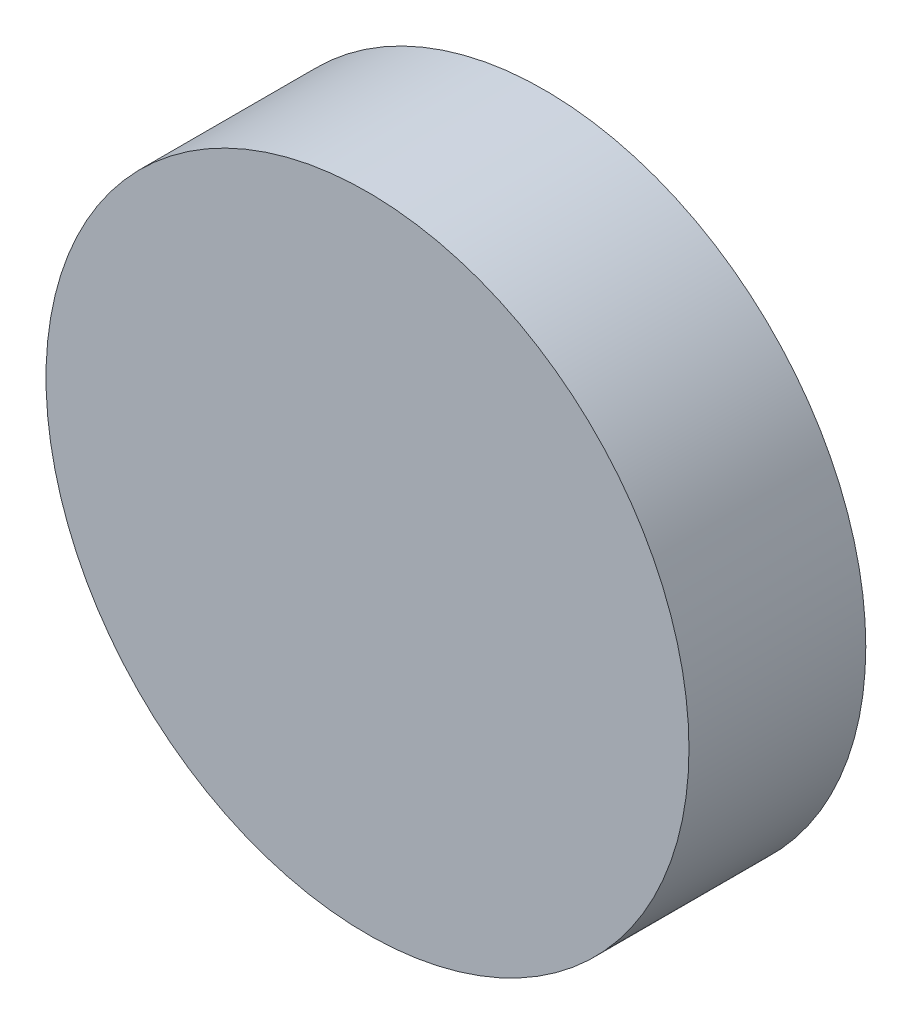
ISO-10303-21;
HEADER;
FILE_DESCRIPTION(('STEP AP214'),'2;1');
FILE_NAME('part.step','',(''),(''),'','','');
FILE_SCHEMA(('AUTOMOTIVE_DESIGN { 1 0 10303 214 1 1 1 1 }'));
ENDSEC;
DATA;
#1=APPLICATION_CONTEXT('core data for automotive mechanical design processes');
#2=APPLICATION_PROTOCOL_DEFINITION('international standard','automotive_design',2000,#1);
#3=PRODUCT_CONTEXT('',#1,'mechanical');
#4=PRODUCT('Part','Part','',(#3));
#5=PRODUCT_RELATED_PRODUCT_CATEGORY('part','',(#4));
#6=PRODUCT_DEFINITION_FORMATION('','',#4);
#7=PRODUCT_DEFINITION_CONTEXT('part definition',#1,'design');
#8=PRODUCT_DEFINITION('design','',#6,#7);
#9=PRODUCT_DEFINITION_SHAPE('','',#8);
#10=(LENGTH_UNIT() NAMED_UNIT(*) SI_UNIT(.MILLI.,.METRE.));
#11=(NAMED_UNIT(*) PLANE_ANGLE_UNIT() SI_UNIT($,.RADIAN.));
#12=(NAMED_UNIT(*) SI_UNIT($,.STERADIAN.) SOLID_ANGLE_UNIT());
#13=UNCERTAINTY_MEASURE_WITH_UNIT(LENGTH_MEASURE(1.E-05),#10,'distance_accuracy_value','');
#14=(GEOMETRIC_REPRESENTATION_CONTEXT(3) GLOBAL_UNCERTAINTY_ASSIGNED_CONTEXT((#13)) GLOBAL_UNIT_ASSIGNED_CONTEXT((#10,
#11,#12)) REPRESENTATION_CONTEXT('',''));
#15=CARTESIAN_POINT('',(0.,0.,0.));
#16=DIRECTION('',(0.,0.,1.));
#17=DIRECTION('',(1.,0.,0.));
#18=AXIS2_PLACEMENT_3D('',#15,#16,#17);
#19=CARTESIAN_POINT('',(0.,0.,11.));
#20=DIRECTION('',(0.,0.,-1.));
#21=DIRECTION('',(-1.,0.,0.));
#22=AXIS2_PLACEMENT_3D('',#19,#20,#21);
#23=CYLINDRICAL_SURFACE('',#22,20.);
#24=CARTESIAN_POINT('',(0.,0.,11.));
#25=DIRECTION('',(0.,0.,1.));
#26=DIRECTION('',(1.,0.,0.));
#27=AXIS2_PLACEMENT_3D('',#24,#25,#26);
#28=CIRCLE('',#27,20.);
#29=CARTESIAN_POINT('',(20.,0.,11.));
#30=VERTEX_POINT('',#29);
#31=EDGE_CURVE('E10',#30,#30,#28,.T.);
#32=ORIENTED_EDGE('',*,*,#31,.F.);
#33=EDGE_LOOP('',(#32));
#34=FACE_BOUND('',#33,.T.);
#35=CARTESIAN_POINT('',(0.,0.,0.));
#36=DIRECTION('',(0.,0.,1.));
#37=DIRECTION('',(1.,0.,0.));
#38=AXIS2_PLACEMENT_3D('',#35,#36,#37);
#39=CIRCLE('',#38,20.);
#40=CARTESIAN_POINT('',(20.,0.,0.));
#41=VERTEX_POINT('',#40);
#42=EDGE_CURVE('E40',#41,#41,#39,.T.);
#43=ORIENTED_EDGE('',*,*,#42,.T.);
#44=EDGE_LOOP('',(#43));
#45=FACE_BOUND('',#44,.T.);
#46=ADVANCED_FACE('F37',(#34,#45),#23,.T.);
#47=CARTESIAN_POINT('',(0.,0.,11.));
#48=DIRECTION('',(0.,0.,1.));
#49=DIRECTION('',(1.,0.,0.));
#50=AXIS2_PLACEMENT_3D('',#47,#48,#49);
#51=PLANE('',#50);
#52=ORIENTED_EDGE('',*,*,#31,.T.);
#53=EDGE_LOOP('',(#52));
#54=FACE_BOUND('',#53,.T.);
#55=ADVANCED_FACE('F54',(#54),#51,.T.);
#56=CARTESIAN_POINT('',(0.,0.,0.));
#57=DIRECTION('',(0.,0.,1.));
#58=DIRECTION('',(1.,0.,0.));
#59=AXIS2_PLACEMENT_3D('',#56,#57,#58);
#60=PLANE('',#59);
#61=ORIENTED_EDGE('',*,*,#42,.F.);
#62=EDGE_LOOP('',(#61));
#63=FACE_BOUND('',#62,.T.);
#64=ADVANCED_FACE('F52',(#63),#60,.F.);
#65=CLOSED_SHELL('',(#46,#55,#64));
#66=MANIFOLD_SOLID_BREP('B2',#65);
#67=ADVANCED_BREP_SHAPE_REPRESENTATION('',(#18,#66),#14);
#68=SHAPE_DEFINITION_REPRESENTATION(#9,#67);
ENDSEC;
END-ISO-10303-21;
